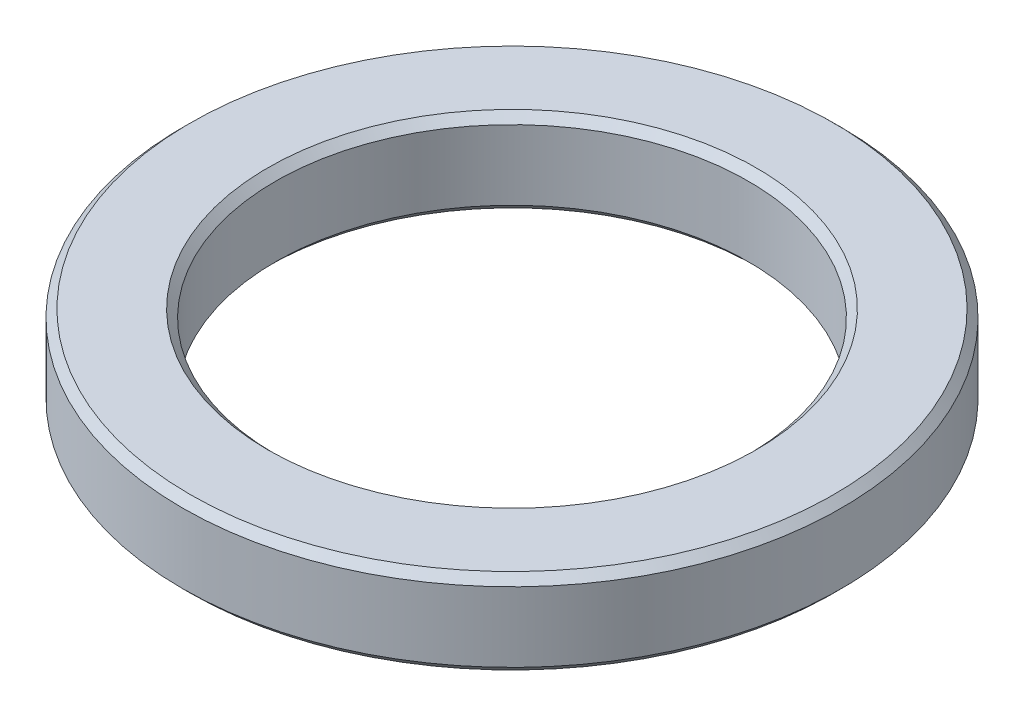
ISO-10303-21;
HEADER;
FILE_DESCRIPTION(('STEP AP214'),'2;1');
FILE_NAME('part.step','',(''),(''),'','','');
FILE_SCHEMA(('AUTOMOTIVE_DESIGN { 1 0 10303 214 1 1 1 1 }'));
ENDSEC;
DATA;
#1=APPLICATION_CONTEXT('core data for automotive mechanical design processes');
#2=APPLICATION_PROTOCOL_DEFINITION('international standard','automotive_design',2000,#1);
#3=PRODUCT_CONTEXT('',#1,'mechanical');
#4=PRODUCT('Part','Part','',(#3));
#5=PRODUCT_RELATED_PRODUCT_CATEGORY('part','',(#4));
#6=PRODUCT_DEFINITION_FORMATION('','',#4);
#7=PRODUCT_DEFINITION_CONTEXT('part definition',#1,'design');
#8=PRODUCT_DEFINITION('design','',#6,#7);
#9=PRODUCT_DEFINITION_SHAPE('','',#8);
#10=(LENGTH_UNIT() NAMED_UNIT(*) SI_UNIT(.MILLI.,.METRE.));
#11=(NAMED_UNIT(*) PLANE_ANGLE_UNIT() SI_UNIT($,.RADIAN.));
#12=(NAMED_UNIT(*) SI_UNIT($,.STERADIAN.) SOLID_ANGLE_UNIT());
#13=UNCERTAINTY_MEASURE_WITH_UNIT(LENGTH_MEASURE(1.E-05),#10,'distance_accuracy_value','');
#14=(GEOMETRIC_REPRESENTATION_CONTEXT(3) GLOBAL_UNCERTAINTY_ASSIGNED_CONTEXT((#13)) GLOBAL_UNIT_ASSIGNED_CONTEXT((#10,
#11,#12)) REPRESENTATION_CONTEXT('',''));
#15=CARTESIAN_POINT('',(0.,0.,0.));
#16=DIRECTION('',(0.,0.,1.));
#17=DIRECTION('',(1.,0.,0.));
#18=AXIS2_PLACEMENT_3D('',#15,#16,#17);
#19=CARTESIAN_POINT('',(0.,1.1,0.));
#20=DIRECTION('',(0.,1.,0.));
#21=DIRECTION('',(0.,0.,1.));
#22=AXIS2_PLACEMENT_3D('',#19,#20,#21);
#23=PLANE('',#22);
#24=CARTESIAN_POINT('',(0.,1.1,0.));
#25=DIRECTION('',(0.,1.,0.));
#26=DIRECTION('',(0.,0.,1.));
#27=AXIS2_PLACEMENT_3D('',#24,#25,#26);
#28=CIRCLE('',#27,3.15);
#29=CARTESIAN_POINT('',(0.,1.1,3.15));
#30=VERTEX_POINT('',#29);
#31=EDGE_CURVE('E10',#30,#30,#28,.F.);
#32=ORIENTED_EDGE('',*,*,#31,.T.);
#33=EDGE_LOOP('',(#32));
#34=FACE_BOUND('',#33,.T.);
#35=CARTESIAN_POINT('',(0.,1.1,0.));
#36=DIRECTION('',(0.,1.,0.));
#37=DIRECTION('',(0.,0.,1.));
#38=AXIS2_PLACEMENT_3D('',#35,#36,#37);
#39=CIRCLE('',#38,4.15);
#40=CARTESIAN_POINT('',(0.,1.1,4.15));
#41=VERTEX_POINT('',#40);
#42=EDGE_CURVE('E42',#41,#41,#39,.T.);
#43=ORIENTED_EDGE('',*,*,#42,.T.);
#44=EDGE_LOOP('',(#43));
#45=FACE_BOUND('',#44,.T.);
#46=ADVANCED_FACE('F34',(#34,#45),#23,.T.);
#47=CARTESIAN_POINT('',(0.,0.,0.));
#48=DIRECTION('',(0.,1.,0.));
#49=DIRECTION('',(0.,0.,1.));
#50=AXIS2_PLACEMENT_3D('',#47,#48,#49);
#51=PLANE('',#50);
#52=CARTESIAN_POINT('',(0.,0.,0.));
#53=DIRECTION('',(0.,1.,0.));
#54=DIRECTION('',(0.,0.,1.));
#55=AXIS2_PLACEMENT_3D('',#52,#53,#54);
#56=CIRCLE('',#55,3.15);
#57=CARTESIAN_POINT('',(0.,0.,3.15));
#58=VERTEX_POINT('',#57);
#59=EDGE_CURVE('E61',#58,#58,#56,.T.);
#60=ORIENTED_EDGE('',*,*,#59,.T.);
#61=EDGE_LOOP('',(#60));
#62=FACE_BOUND('',#61,.T.);
#63=CARTESIAN_POINT('',(0.,0.,0.));
#64=DIRECTION('',(0.,1.,0.));
#65=DIRECTION('',(0.,0.,1.));
#66=AXIS2_PLACEMENT_3D('',#63,#64,#65);
#67=CIRCLE('',#66,4.15);
#68=CARTESIAN_POINT('',(0.,0.,4.15));
#69=VERTEX_POINT('',#68);
#70=EDGE_CURVE('E64',#69,#69,#67,.F.);
#71=ORIENTED_EDGE('',*,*,#70,.T.);
#72=EDGE_LOOP('',(#71));
#73=FACE_BOUND('',#72,.T.);
#74=ADVANCED_FACE('F68',(#62,#73),#51,.F.);
#75=CARTESIAN_POINT('',(0.,1.1,0.));
#76=DIRECTION('',(0.,-1.,0.));
#77=DIRECTION('',(0.,0.,-1.));
#78=AXIS2_PLACEMENT_3D('',#75,#76,#77);
#79=CYLINDRICAL_SURFACE('',#78,4.25);
#80=CARTESIAN_POINT('',(0.,0.0999999999999994,0.));
#81=DIRECTION('',(0.,1.,0.));
#82=DIRECTION('',(0.,0.,1.));
#83=AXIS2_PLACEMENT_3D('',#80,#81,#82);
#84=CIRCLE('',#83,4.25);
#85=CARTESIAN_POINT('',(0.,0.0999999999999994,4.25));
#86=VERTEX_POINT('',#85);
#87=EDGE_CURVE('E46',#86,#86,#84,.T.);
#88=ORIENTED_EDGE('',*,*,#87,.T.);
#89=EDGE_LOOP('',(#88));
#90=FACE_BOUND('',#89,.T.);
#91=CARTESIAN_POINT('',(0.,1.,0.));
#92=DIRECTION('',(0.,1.,0.));
#93=DIRECTION('',(0.,0.,1.));
#94=AXIS2_PLACEMENT_3D('',#91,#92,#93);
#95=CIRCLE('',#94,4.25);
#96=CARTESIAN_POINT('',(0.,1.,4.25));
#97=VERTEX_POINT('',#96);
#98=EDGE_CURVE('E50',#97,#97,#95,.F.);
#99=ORIENTED_EDGE('',*,*,#98,.T.);
#100=EDGE_LOOP('',(#99));
#101=FACE_BOUND('',#100,.T.);
#102=ADVANCED_FACE('F78',(#90,#101),#79,.T.);
#103=CARTESIAN_POINT('',(0.,1.1,0.));
#104=DIRECTION('',(0.,-1.,0.));
#105=DIRECTION('',(0.,0.,-1.));
#106=AXIS2_PLACEMENT_3D('',#103,#104,#105);
#107=CYLINDRICAL_SURFACE('',#106,3.05);
#108=CARTESIAN_POINT('',(0.,0.100000000000002,0.));
#109=DIRECTION('',(0.,1.,0.));
#110=DIRECTION('',(0.,0.,1.));
#111=AXIS2_PLACEMENT_3D('',#108,#109,#110);
#112=CIRCLE('',#111,3.05);
#113=CARTESIAN_POINT('',(0.,0.100000000000002,3.05));
#114=VERTEX_POINT('',#113);
#115=EDGE_CURVE('E55',#114,#114,#112,.F.);
#116=ORIENTED_EDGE('',*,*,#115,.T.);
#117=EDGE_LOOP('',(#116));
#118=FACE_BOUND('',#117,.T.);
#119=CARTESIAN_POINT('',(0.,1.,0.));
#120=DIRECTION('',(0.,1.,0.));
#121=DIRECTION('',(0.,0.,1.));
#122=AXIS2_PLACEMENT_3D('',#119,#120,#121);
#123=CIRCLE('',#122,3.05);
#124=CARTESIAN_POINT('',(0.,1.,3.05));
#125=VERTEX_POINT('',#124);
#126=EDGE_CURVE('E58',#125,#125,#123,.T.);
#127=ORIENTED_EDGE('',*,*,#126,.T.);
#128=EDGE_LOOP('',(#127));
#129=FACE_BOUND('',#128,.T.);
#130=ADVANCED_FACE('F81',(#118,#129),#107,.F.);
#131=CARTESIAN_POINT('',(0.,0.,0.));
#132=DIRECTION('',(0.,-1.,0.));
#133=DIRECTION('',(0.,0.,-1.));
#134=AXIS2_PLACEMENT_3D('',#131,#132,#133);
#135=CONICAL_SURFACE('',#134,3.15,0.78539816339745);
#136=ORIENTED_EDGE('',*,*,#115,.F.);
#137=EDGE_LOOP('',(#136));
#138=FACE_BOUND('',#137,.T.);
#139=ORIENTED_EDGE('',*,*,#59,.F.);
#140=EDGE_LOOP('',(#139));
#141=FACE_BOUND('',#140,.T.);
#142=ADVANCED_FACE('F74',(#138,#141),#135,.F.);
#143=CARTESIAN_POINT('',(0.,0.0999999999999994,0.));
#144=DIRECTION('',(0.,1.,0.));
#145=DIRECTION('',(0.,0.,1.));
#146=AXIS2_PLACEMENT_3D('',#143,#144,#145);
#147=CONICAL_SURFACE('',#146,4.25,0.785398163397453);
#148=ORIENTED_EDGE('',*,*,#70,.F.);
#149=EDGE_LOOP('',(#148));
#150=FACE_BOUND('',#149,.T.);
#151=ORIENTED_EDGE('',*,*,#87,.F.);
#152=EDGE_LOOP('',(#151));
#153=FACE_BOUND('',#152,.T.);
#154=ADVANCED_FACE('F70',(#150,#153),#147,.T.);
#155=CARTESIAN_POINT('',(0.,1.,0.));
#156=DIRECTION('',(0.,1.,0.));
#157=DIRECTION('',(0.,0.,1.));
#158=AXIS2_PLACEMENT_3D('',#155,#156,#157);
#159=CONICAL_SURFACE('',#158,3.05,0.785398163397453);
#160=ORIENTED_EDGE('',*,*,#31,.F.);
#161=EDGE_LOOP('',(#160));
#162=FACE_BOUND('',#161,.T.);
#163=ORIENTED_EDGE('',*,*,#126,.F.);
#164=EDGE_LOOP('',(#163));
#165=FACE_BOUND('',#164,.T.);
#166=ADVANCED_FACE('F73',(#162,#165),#159,.F.);
#167=CARTESIAN_POINT('',(0.,1.1,0.));
#168=DIRECTION('',(0.,-1.,0.));
#169=DIRECTION('',(0.,0.,-1.));
#170=AXIS2_PLACEMENT_3D('',#167,#168,#169);
#171=CONICAL_SURFACE('',#170,4.15,0.785398163397453);
#172=ORIENTED_EDGE('',*,*,#98,.F.);
#173=EDGE_LOOP('',(#172));
#174=FACE_BOUND('',#173,.T.);
#175=ORIENTED_EDGE('',*,*,#42,.F.);
#176=EDGE_LOOP('',(#175));
#177=FACE_BOUND('',#176,.T.);
#178=ADVANCED_FACE('F37',(#174,#177),#171,.T.);
#179=CLOSED_SHELL('',(#46,#74,#102,#130,#142,#154,#166,#178));
#180=MANIFOLD_SOLID_BREP('B2',#179);
#181=ADVANCED_BREP_SHAPE_REPRESENTATION('',(#18,#180),#14);
#182=SHAPE_DEFINITION_REPRESENTATION(#9,#181);
ENDSEC;
END-ISO-10303-21;
